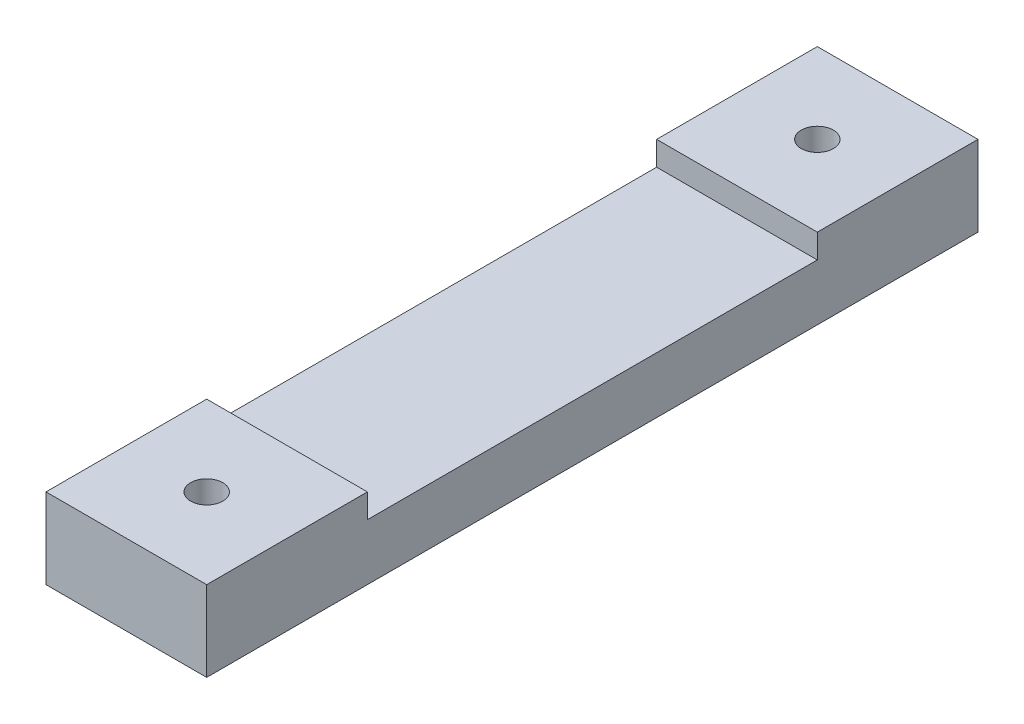
ISO-10303-21;
HEADER;
FILE_DESCRIPTION(('STEP AP214'),'2;1');
FILE_NAME('part.step','',(''),(''),'','','');
FILE_SCHEMA(('AUTOMOTIVE_DESIGN { 1 0 10303 214 1 1 1 1 }'));
ENDSEC;
DATA;
#1=APPLICATION_CONTEXT('core data for automotive mechanical design processes');
#2=APPLICATION_PROTOCOL_DEFINITION('international standard','automotive_design',2000,#1);
#3=PRODUCT_CONTEXT('',#1,'mechanical');
#4=PRODUCT('Part','Part','',(#3));
#5=PRODUCT_RELATED_PRODUCT_CATEGORY('part','',(#4));
#6=PRODUCT_DEFINITION_FORMATION('','',#4);
#7=PRODUCT_DEFINITION_CONTEXT('part definition',#1,'design');
#8=PRODUCT_DEFINITION('design','',#6,#7);
#9=PRODUCT_DEFINITION_SHAPE('','',#8);
#10=(LENGTH_UNIT() NAMED_UNIT(*) SI_UNIT(.MILLI.,.METRE.));
#11=(NAMED_UNIT(*) PLANE_ANGLE_UNIT() SI_UNIT($,.RADIAN.));
#12=(NAMED_UNIT(*) SI_UNIT($,.STERADIAN.) SOLID_ANGLE_UNIT());
#13=UNCERTAINTY_MEASURE_WITH_UNIT(LENGTH_MEASURE(1.E-05),#10,'distance_accuracy_value','');
#14=(GEOMETRIC_REPRESENTATION_CONTEXT(3) GLOBAL_UNCERTAINTY_ASSIGNED_CONTEXT((#13)) GLOBAL_UNIT_ASSIGNED_CONTEXT((#10,
#11,#12)) REPRESENTATION_CONTEXT('',''));
#15=CARTESIAN_POINT('',(0.,0.,0.));
#16=DIRECTION('',(0.,0.,1.));
#17=DIRECTION('',(1.,0.,0.));
#18=AXIS2_PLACEMENT_3D('',#15,#16,#17);
#19=CARTESIAN_POINT('',(0.,3.5,0.));
#20=DIRECTION('',(0.,1.,0.));
#21=DIRECTION('',(0.,0.,1.));
#22=AXIS2_PLACEMENT_3D('',#19,#20,#21);
#23=PLANE('',#22);
#24=DIRECTION('',(0.,0.,1.));
#25=VECTOR('',#24,1.);
#26=CARTESIAN_POINT('',(-4.85436893203884,3.5,-22.9928966630061));
#27=LINE('',#26,#25);
#28=CARTESIAN_POINT('',(-4.85436893203884,3.5,-12.9928966630061));
#29=VERTEX_POINT('',#28);
#30=CARTESIAN_POINT('',(-4.85436893203883,3.5,15.0071033369939));
#31=VERTEX_POINT('',#30);
#32=EDGE_CURVE('E150',#29,#31,#27,.T.);
#33=ORIENTED_EDGE('',*,*,#32,.T.);
#34=DIRECTION('',(-1.,0.,0.));
#35=VECTOR('',#34,1.);
#36=CARTESIAN_POINT('',(-4.85436893203883,3.5,15.0071033369939));
#37=LINE('',#36,#35);
#38=CARTESIAN_POINT('',(5.14563106796117,3.5,15.0071033369939));
#39=VERTEX_POINT('',#38);
#40=EDGE_CURVE('E119',#39,#31,#37,.T.);
#41=ORIENTED_EDGE('',*,*,#40,.F.);
#42=DIRECTION('',(0.,0.,-1.));
#43=VECTOR('',#42,1.);
#44=CARTESIAN_POINT('',(5.14563106796116,3.5,-22.9928966630061));
#45=LINE('',#44,#43);
#46=CARTESIAN_POINT('',(5.14563106796117,3.5,-12.9928966630061));
#47=VERTEX_POINT('',#46);
#48=EDGE_CURVE('E152',#39,#47,#45,.T.);
#49=ORIENTED_EDGE('',*,*,#48,.T.);
#50=DIRECTION('',(1.,0.,0.));
#51=VECTOR('',#50,1.);
#52=CARTESIAN_POINT('',(-4.85436893203884,3.5,-12.9928966630061));
#53=LINE('',#52,#51);
#54=EDGE_CURVE('E56',#29,#47,#53,.T.);
#55=ORIENTED_EDGE('',*,*,#54,.F.);
#56=EDGE_LOOP('',(#33,#41,#49,#55));
#57=FACE_BOUND('',#56,.T.);
#58=ADVANCED_FACE('F33',(#57),#23,.T.);
#59=CARTESIAN_POINT('',(-4.85436893203884,3.5,-22.9928966630061));
#60=DIRECTION('',(1.,0.,0.));
#61=DIRECTION('',(0.,0.,-1.));
#62=AXIS2_PLACEMENT_3D('',#59,#60,#61);
#63=PLANE('',#62);
#64=DIRECTION('',(0.,0.,1.));
#65=VECTOR('',#64,1.);
#66=CARTESIAN_POINT('',(-4.85436893203884,0.,-22.9928966630061));
#67=LINE('',#66,#65);
#68=CARTESIAN_POINT('',(-4.85436893203884,0.,-22.9928966630061));
#69=VERTEX_POINT('',#68);
#70=CARTESIAN_POINT('',(-4.85436893203883,0.,25.0071033369939));
#71=VERTEX_POINT('',#70);
#72=EDGE_CURVE('E106',#69,#71,#67,.T.);
#73=ORIENTED_EDGE('',*,*,#72,.T.);
#74=DIRECTION('',(0.,-1.,0.));
#75=VECTOR('',#74,1.);
#76=CARTESIAN_POINT('',(-4.85436893203883,3.5,25.0071033369939));
#77=LINE('',#76,#75);
#78=CARTESIAN_POINT('',(-4.85436893203883,5.,25.0071033369939));
#79=VERTEX_POINT('',#78);
#80=EDGE_CURVE('E11',#79,#71,#77,.T.);
#81=ORIENTED_EDGE('',*,*,#80,.F.);
#82=DIRECTION('',(0.,0.,1.));
#83=VECTOR('',#82,1.);
#84=CARTESIAN_POINT('',(-4.85436893203883,5.,25.0071033369939));
#85=LINE('',#84,#83);
#86=CARTESIAN_POINT('',(-4.85436893203883,5.,15.0071033369939));
#87=VERTEX_POINT('',#86);
#88=EDGE_CURVE('E103',#87,#79,#85,.T.);
#89=ORIENTED_EDGE('',*,*,#88,.F.);
#90=DIRECTION('',(0.,-1.,0.));
#91=VECTOR('',#90,1.);
#92=CARTESIAN_POINT('',(-4.85436893203883,5.,15.0071033369939));
#93=LINE('',#92,#91);
#94=EDGE_CURVE('E128',#87,#31,#93,.T.);
#95=ORIENTED_EDGE('',*,*,#94,.T.);
#96=ORIENTED_EDGE('',*,*,#32,.F.);
#97=DIRECTION('',(0.,-1.,0.));
#98=VECTOR('',#97,1.);
#99=CARTESIAN_POINT('',(-4.85436893203884,5.,-12.9928966630061));
#100=LINE('',#99,#98);
#101=CARTESIAN_POINT('',(-4.85436893203884,5.,-12.9928966630061));
#102=VERTEX_POINT('',#101);
#103=EDGE_CURVE('E147',#102,#29,#100,.T.);
#104=ORIENTED_EDGE('',*,*,#103,.F.);
#105=DIRECTION('',(0.,0.,1.));
#106=VECTOR('',#105,1.);
#107=CARTESIAN_POINT('',(-4.85436893203884,5.,-22.9928966630061));
#108=LINE('',#107,#106);
#109=CARTESIAN_POINT('',(-4.85436893203884,5.,-22.9928966630061));
#110=VERTEX_POINT('',#109);
#111=EDGE_CURVE('E132',#110,#102,#108,.T.);
#112=ORIENTED_EDGE('',*,*,#111,.F.);
#113=DIRECTION('',(0.,-1.,0.));
#114=VECTOR('',#113,1.);
#115=CARTESIAN_POINT('',(-4.85436893203884,3.5,-22.9928966630061));
#116=LINE('',#115,#114);
#117=EDGE_CURVE('E155',#110,#69,#116,.T.);
#118=ORIENTED_EDGE('',*,*,#117,.T.);
#119=EDGE_LOOP('',(#73,#81,#89,#95,#96,#104,#112,#118));
#120=FACE_BOUND('',#119,.T.);
#121=ADVANCED_FACE('F35',(#120),#63,.F.);
#122=CARTESIAN_POINT('',(-4.85436893203883,3.5,25.0071033369939));
#123=DIRECTION('',(0.,0.,-1.));
#124=DIRECTION('',(-1.,0.,0.));
#125=AXIS2_PLACEMENT_3D('',#122,#123,#124);
#126=PLANE('',#125);
#127=DIRECTION('',(1.,0.,0.));
#128=VECTOR('',#127,1.);
#129=CARTESIAN_POINT('',(-4.85436893203883,0.,25.0071033369939));
#130=LINE('',#129,#128);
#131=CARTESIAN_POINT('',(5.14563106796117,0.,25.0071033369939));
#132=VERTEX_POINT('',#131);
#133=EDGE_CURVE('E157',#71,#132,#130,.T.);
#134=ORIENTED_EDGE('',*,*,#133,.T.);
#135=DIRECTION('',(0.,-1.,0.));
#136=VECTOR('',#135,1.);
#137=CARTESIAN_POINT('',(5.14563106796117,3.5,25.0071033369939));
#138=LINE('',#137,#136);
#139=CARTESIAN_POINT('',(5.14563106796117,5.,25.0071033369939));
#140=VERTEX_POINT('',#139);
#141=EDGE_CURVE('E41',#140,#132,#138,.T.);
#142=ORIENTED_EDGE('',*,*,#141,.F.);
#143=DIRECTION('',(1.,0.,0.));
#144=VECTOR('',#143,1.);
#145=CARTESIAN_POINT('',(-4.85436893203883,5.,25.0071033369939));
#146=LINE('',#145,#144);
#147=EDGE_CURVE('E109',#79,#140,#146,.T.);
#148=ORIENTED_EDGE('',*,*,#147,.F.);
#149=ORIENTED_EDGE('',*,*,#80,.T.);
#150=EDGE_LOOP('',(#134,#142,#148,#149));
#151=FACE_BOUND('',#150,.T.);
#152=ADVANCED_FACE('F110',(#151),#126,.F.);
#153=CARTESIAN_POINT('',(5.14563106796116,3.5,-22.9928966630061));
#154=DIRECTION('',(-1.,0.,0.));
#155=DIRECTION('',(0.,0.,1.));
#156=AXIS2_PLACEMENT_3D('',#153,#154,#155);
#157=PLANE('',#156);
#158=DIRECTION('',(0.,0.,-1.));
#159=VECTOR('',#158,1.);
#160=CARTESIAN_POINT('',(5.14563106796116,0.,-22.9928966630061));
#161=LINE('',#160,#159);
#162=CARTESIAN_POINT('',(5.14563106796116,0.,-22.9928966630061));
#163=VERTEX_POINT('',#162);
#164=EDGE_CURVE('E159',#132,#163,#161,.T.);
#165=ORIENTED_EDGE('',*,*,#164,.T.);
#166=DIRECTION('',(0.,-1.,0.));
#167=VECTOR('',#166,1.);
#168=CARTESIAN_POINT('',(5.14563106796116,3.5,-22.9928966630061));
#169=LINE('',#168,#167);
#170=CARTESIAN_POINT('',(5.14563106796116,5.,-22.9928966630061));
#171=VERTEX_POINT('',#170);
#172=EDGE_CURVE('E163',#171,#163,#169,.T.);
#173=ORIENTED_EDGE('',*,*,#172,.F.);
#174=DIRECTION('',(0.,0.,-1.));
#175=VECTOR('',#174,1.);
#176=CARTESIAN_POINT('',(5.14563106796116,5.,-22.9928966630061));
#177=LINE('',#176,#175);
#178=CARTESIAN_POINT('',(5.14563106796117,5.,-12.9928966630061));
#179=VERTEX_POINT('',#178);
#180=EDGE_CURVE('E137',#179,#171,#177,.T.);
#181=ORIENTED_EDGE('',*,*,#180,.F.);
#182=DIRECTION('',(0.,-1.,0.));
#183=VECTOR('',#182,1.);
#184=CARTESIAN_POINT('',(5.14563106796117,5.,-12.9928966630061));
#185=LINE('',#184,#183);
#186=EDGE_CURVE('E143',#179,#47,#185,.T.);
#187=ORIENTED_EDGE('',*,*,#186,.T.);
#188=ORIENTED_EDGE('',*,*,#48,.F.);
#189=DIRECTION('',(0.,-1.,0.));
#190=VECTOR('',#189,1.);
#191=CARTESIAN_POINT('',(5.14563106796117,5.,15.0071033369939));
#192=LINE('',#191,#190);
#193=CARTESIAN_POINT('',(5.14563106796117,5.,15.0071033369939));
#194=VERTEX_POINT('',#193);
#195=EDGE_CURVE('E48',#194,#39,#192,.T.);
#196=ORIENTED_EDGE('',*,*,#195,.F.);
#197=DIRECTION('',(0.,0.,-1.));
#198=VECTOR('',#197,1.);
#199=CARTESIAN_POINT('',(5.14563106796117,5.,25.0071033369939));
#200=LINE('',#199,#198);
#201=EDGE_CURVE('E114',#140,#194,#200,.T.);
#202=ORIENTED_EDGE('',*,*,#201,.F.);
#203=ORIENTED_EDGE('',*,*,#141,.T.);
#204=EDGE_LOOP('',(#165,#173,#181,#187,#188,#196,#202,#203));
#205=FACE_BOUND('',#204,.T.);
#206=ADVANCED_FACE('F167',(#205),#157,.F.);
#207=CARTESIAN_POINT('',(-4.85436893203884,3.5,-22.9928966630061));
#208=DIRECTION('',(0.,0.,1.));
#209=DIRECTION('',(1.,0.,0.));
#210=AXIS2_PLACEMENT_3D('',#207,#208,#209);
#211=PLANE('',#210);
#212=DIRECTION('',(-1.,0.,0.));
#213=VECTOR('',#212,1.);
#214=CARTESIAN_POINT('',(-4.85436893203884,0.,-22.9928966630061));
#215=LINE('',#214,#213);
#216=EDGE_CURVE('E153',#163,#69,#215,.T.);
#217=ORIENTED_EDGE('',*,*,#216,.T.);
#218=ORIENTED_EDGE('',*,*,#117,.F.);
#219=DIRECTION('',(-1.,0.,0.));
#220=VECTOR('',#219,1.);
#221=CARTESIAN_POINT('',(-4.85436893203884,5.,-22.9928966630061));
#222=LINE('',#221,#220);
#223=EDGE_CURVE('E140',#171,#110,#222,.T.);
#224=ORIENTED_EDGE('',*,*,#223,.F.);
#225=ORIENTED_EDGE('',*,*,#172,.T.);
#226=EDGE_LOOP('',(#217,#218,#224,#225));
#227=FACE_BOUND('',#226,.T.);
#228=ADVANCED_FACE('F172',(#227),#211,.F.);
#229=CARTESIAN_POINT('',(0.,0.,0.));
#230=DIRECTION('',(0.,1.,0.));
#231=DIRECTION('',(0.,0.,1.));
#232=AXIS2_PLACEMENT_3D('',#229,#230,#231);
#233=PLANE('',#232);
#234=CARTESIAN_POINT('',(0.145631067961163,0.,-17.9928966630061));
#235=DIRECTION('',(0.,1.,0.));
#236=DIRECTION('',(0.,0.,1.));
#237=AXIS2_PLACEMENT_3D('',#234,#235,#236);
#238=CIRCLE('',#237,1.);
#239=CARTESIAN_POINT('',(0.145631067961163,0.,-16.9928966630061));
#240=VERTEX_POINT('',#239);
#241=EDGE_CURVE('E121',#240,#240,#238,.T.);
#242=ORIENTED_EDGE('',*,*,#241,.T.);
#243=EDGE_LOOP('',(#242));
#244=FACE_BOUND('',#243,.T.);
#245=CARTESIAN_POINT('',(0.145631067961168,0.,20.0071033369939));
#246=DIRECTION('',(0.,1.,0.));
#247=DIRECTION('',(0.,0.,1.));
#248=AXIS2_PLACEMENT_3D('',#245,#246,#247);
#249=CIRCLE('',#248,1.);
#250=CARTESIAN_POINT('',(0.145631067961168,0.,21.0071033369939));
#251=VERTEX_POINT('',#250);
#252=EDGE_CURVE('E274',#251,#251,#249,.T.);
#253=ORIENTED_EDGE('',*,*,#252,.T.);
#254=EDGE_LOOP('',(#253));
#255=FACE_BOUND('',#254,.T.);
#256=ORIENTED_EDGE('',*,*,#72,.F.);
#257=ORIENTED_EDGE('',*,*,#216,.F.);
#258=ORIENTED_EDGE('',*,*,#164,.F.);
#259=ORIENTED_EDGE('',*,*,#133,.F.);
#260=EDGE_LOOP('',(#256,#257,#258,#259));
#261=FACE_BOUND('',#260,.T.);
#262=ADVANCED_FACE('F170',(#244,#255,#261),#233,.F.);
#263=CARTESIAN_POINT('',(-4.85436893203884,5.,-12.9928966630061));
#264=DIRECTION('',(0.,0.,-1.));
#265=DIRECTION('',(-1.,0.,0.));
#266=AXIS2_PLACEMENT_3D('',#263,#264,#265);
#267=PLANE('',#266);
#268=ORIENTED_EDGE('',*,*,#54,.T.);
#269=ORIENTED_EDGE('',*,*,#186,.F.);
#270=DIRECTION('',(1.,0.,0.));
#271=VECTOR('',#270,1.);
#272=CARTESIAN_POINT('',(-4.85436893203884,5.,-12.9928966630061));
#273=LINE('',#272,#271);
#274=EDGE_CURVE('E135',#102,#179,#273,.T.);
#275=ORIENTED_EDGE('',*,*,#274,.F.);
#276=ORIENTED_EDGE('',*,*,#103,.T.);
#277=EDGE_LOOP('',(#268,#269,#275,#276));
#278=FACE_BOUND('',#277,.T.);
#279=ADVANCED_FACE('F182',(#278),#267,.F.);
#280=CARTESIAN_POINT('',(0.,5.,0.));
#281=DIRECTION('',(0.,1.,0.));
#282=DIRECTION('',(0.,0.,1.));
#283=AXIS2_PLACEMENT_3D('',#280,#281,#282);
#284=PLANE('',#283);
#285=CARTESIAN_POINT('',(0.145631067961163,5.,-17.9928966630061));
#286=DIRECTION('',(0.,1.,0.));
#287=DIRECTION('',(0.,0.,1.));
#288=AXIS2_PLACEMENT_3D('',#285,#286,#287);
#289=CIRCLE('',#288,1.);
#290=CARTESIAN_POINT('',(0.145631067961163,5.,-16.9928966630061));
#291=VERTEX_POINT('',#290);
#292=EDGE_CURVE('E273',#291,#291,#289,.T.);
#293=ORIENTED_EDGE('',*,*,#292,.F.);
#294=EDGE_LOOP('',(#293));
#295=FACE_BOUND('',#294,.T.);
#296=ORIENTED_EDGE('',*,*,#111,.T.);
#297=ORIENTED_EDGE('',*,*,#274,.T.);
#298=ORIENTED_EDGE('',*,*,#180,.T.);
#299=ORIENTED_EDGE('',*,*,#223,.T.);
#300=EDGE_LOOP('',(#296,#297,#298,#299));
#301=FACE_BOUND('',#300,.T.);
#302=ADVANCED_FACE('F177',(#295,#301),#284,.T.);
#303=CARTESIAN_POINT('',(-4.85436893203883,5.,15.0071033369939));
#304=DIRECTION('',(0.,0.,1.));
#305=DIRECTION('',(1.,0.,0.));
#306=AXIS2_PLACEMENT_3D('',#303,#304,#305);
#307=PLANE('',#306);
#308=ORIENTED_EDGE('',*,*,#40,.T.);
#309=ORIENTED_EDGE('',*,*,#94,.F.);
#310=DIRECTION('',(-1.,0.,0.));
#311=VECTOR('',#310,1.);
#312=CARTESIAN_POINT('',(-4.85436893203883,5.,15.0071033369939));
#313=LINE('',#312,#311);
#314=EDGE_CURVE('E117',#194,#87,#313,.T.);
#315=ORIENTED_EDGE('',*,*,#314,.F.);
#316=ORIENTED_EDGE('',*,*,#195,.T.);
#317=EDGE_LOOP('',(#308,#309,#315,#316));
#318=FACE_BOUND('',#317,.T.);
#319=ADVANCED_FACE('F189',(#318),#307,.F.);
#320=CARTESIAN_POINT('',(0.,5.,0.));
#321=DIRECTION('',(0.,-1.,0.));
#322=DIRECTION('',(0.,0.,-1.));
#323=AXIS2_PLACEMENT_3D('',#320,#321,#322);
#324=PLANE('',#323);
#325=CARTESIAN_POINT('',(0.145631067961168,5.,20.0071033369939));
#326=DIRECTION('',(0.,1.,0.));
#327=DIRECTION('',(0.,0.,1.));
#328=AXIS2_PLACEMENT_3D('',#325,#326,#327);
#329=CIRCLE('',#328,1.);
#330=CARTESIAN_POINT('',(0.145631067961168,5.,21.0071033369939));
#331=VERTEX_POINT('',#330);
#332=EDGE_CURVE('E124',#331,#331,#329,.T.);
#333=ORIENTED_EDGE('',*,*,#332,.F.);
#334=EDGE_LOOP('',(#333));
#335=FACE_BOUND('',#334,.T.);
#336=ORIENTED_EDGE('',*,*,#88,.T.);
#337=ORIENTED_EDGE('',*,*,#147,.T.);
#338=ORIENTED_EDGE('',*,*,#201,.T.);
#339=ORIENTED_EDGE('',*,*,#314,.T.);
#340=EDGE_LOOP('',(#336,#337,#338,#339));
#341=FACE_BOUND('',#340,.T.);
#342=ADVANCED_FACE('F116',(#335,#341),#324,.F.);
#343=CARTESIAN_POINT('',(0.145631067961168,0.,20.0071033369939));
#344=DIRECTION('',(0.,1.,0.));
#345=DIRECTION('',(0.,0.,1.));
#346=AXIS2_PLACEMENT_3D('',#343,#344,#345);
#347=CYLINDRICAL_SURFACE('',#346,1.);
#348=ORIENTED_EDGE('',*,*,#252,.F.);
#349=EDGE_LOOP('',(#348));
#350=FACE_BOUND('',#349,.T.);
#351=ORIENTED_EDGE('',*,*,#332,.T.);
#352=EDGE_LOOP('',(#351));
#353=FACE_BOUND('',#352,.T.);
#354=ADVANCED_FACE('F242',(#350,#353),#347,.F.);
#355=CARTESIAN_POINT('',(0.145631067961163,0.,-17.9928966630061));
#356=DIRECTION('',(0.,1.,0.));
#357=DIRECTION('',(0.,0.,1.));
#358=AXIS2_PLACEMENT_3D('',#355,#356,#357);
#359=CYLINDRICAL_SURFACE('',#358,1.);
#360=ORIENTED_EDGE('',*,*,#241,.F.);
#361=EDGE_LOOP('',(#360));
#362=FACE_BOUND('',#361,.T.);
#363=ORIENTED_EDGE('',*,*,#292,.T.);
#364=EDGE_LOOP('',(#363));
#365=FACE_BOUND('',#364,.T.);
#366=ADVANCED_FACE('F252',(#362,#365),#359,.F.);
#367=CLOSED_SHELL('',(#58,#121,#152,#206,#228,#262,#279,#302,#319,#342,#354,#366));
#368=MANIFOLD_SOLID_BREP('B2',#367);
#369=ADVANCED_BREP_SHAPE_REPRESENTATION('',(#18,#368),#14);
#370=SHAPE_DEFINITION_REPRESENTATION(#9,#369);
ENDSEC;
END-ISO-10303-21;
